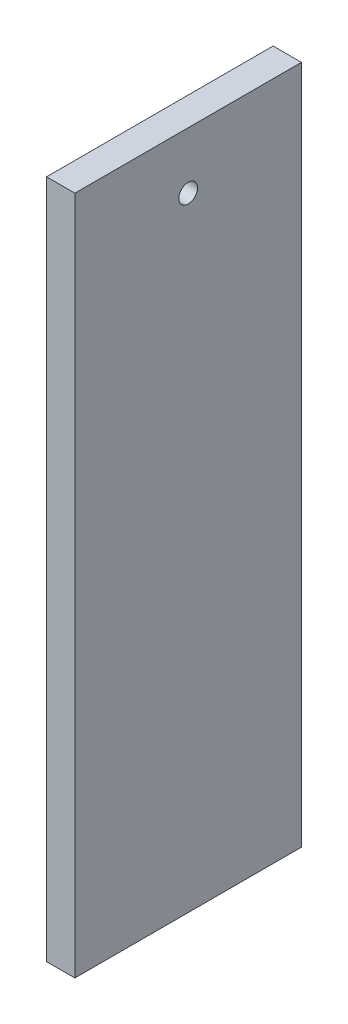
ISO-10303-21;
HEADER;
FILE_DESCRIPTION(('STEP AP214'),'2;1');
FILE_NAME('part.step','',(''),(''),'','','');
FILE_SCHEMA(('AUTOMOTIVE_DESIGN { 1 0 10303 214 1 1 1 1 }'));
ENDSEC;
DATA;
#1=APPLICATION_CONTEXT('core data for automotive mechanical design processes');
#2=APPLICATION_PROTOCOL_DEFINITION('international standard','automotive_design',2000,#1);
#3=PRODUCT_CONTEXT('',#1,'mechanical');
#4=PRODUCT('Part','Part','',(#3));
#5=PRODUCT_RELATED_PRODUCT_CATEGORY('part','',(#4));
#6=PRODUCT_DEFINITION_FORMATION('','',#4);
#7=PRODUCT_DEFINITION_CONTEXT('part definition',#1,'design');
#8=PRODUCT_DEFINITION('design','',#6,#7);
#9=PRODUCT_DEFINITION_SHAPE('','',#8);
#10=(LENGTH_UNIT() NAMED_UNIT(*) SI_UNIT(.MILLI.,.METRE.));
#11=(NAMED_UNIT(*) PLANE_ANGLE_UNIT() SI_UNIT($,.RADIAN.));
#12=(NAMED_UNIT(*) SI_UNIT($,.STERADIAN.) SOLID_ANGLE_UNIT());
#13=UNCERTAINTY_MEASURE_WITH_UNIT(LENGTH_MEASURE(1.E-05),#10,'distance_accuracy_value','');
#14=(GEOMETRIC_REPRESENTATION_CONTEXT(3) GLOBAL_UNCERTAINTY_ASSIGNED_CONTEXT((#13)) GLOBAL_UNIT_ASSIGNED_CONTEXT((#10,
#11,#12)) REPRESENTATION_CONTEXT('',''));
#15=CARTESIAN_POINT('',(0.,0.,0.));
#16=DIRECTION('',(0.,0.,1.));
#17=DIRECTION('',(1.,0.,0.));
#18=AXIS2_PLACEMENT_3D('',#15,#16,#17);
#19=CARTESIAN_POINT('',(5.,0.,0.));
#20=DIRECTION('',(0.,-1.,0.));
#21=DIRECTION('',(0.,0.,-1.));
#22=AXIS2_PLACEMENT_3D('',#19,#20,#21);
#23=PLANE('',#22);
#24=DIRECTION('',(0.,0.,1.));
#25=VECTOR('',#24,1.);
#26=CARTESIAN_POINT('',(0.,0.,0.));
#27=LINE('',#26,#25);
#28=CARTESIAN_POINT('',(0.,0.,0.));
#29=VERTEX_POINT('',#28);
#30=CARTESIAN_POINT('',(0.,0.,40.));
#31=VERTEX_POINT('',#30);
#32=EDGE_CURVE('E100',#29,#31,#27,.T.);
#33=ORIENTED_EDGE('',*,*,#32,.F.);
#34=DIRECTION('',(-1.,0.,0.));
#35=VECTOR('',#34,1.);
#36=CARTESIAN_POINT('',(5.,0.,0.));
#37=LINE('',#36,#35);
#38=CARTESIAN_POINT('',(5.,0.,0.));
#39=VERTEX_POINT('',#38);
#40=EDGE_CURVE('E11',#39,#29,#37,.T.);
#41=ORIENTED_EDGE('',*,*,#40,.F.);
#42=DIRECTION('',(0.,0.,1.));
#43=VECTOR('',#42,1.);
#44=CARTESIAN_POINT('',(5.,0.,0.));
#45=LINE('',#44,#43);
#46=CARTESIAN_POINT('',(5.,0.,40.));
#47=VERTEX_POINT('',#46);
#48=EDGE_CURVE('E94',#39,#47,#45,.T.);
#49=ORIENTED_EDGE('',*,*,#48,.T.);
#50=DIRECTION('',(-1.,0.,0.));
#51=VECTOR('',#50,1.);
#52=CARTESIAN_POINT('',(5.,0.,40.));
#53=LINE('',#52,#51);
#54=EDGE_CURVE('E37',#47,#31,#53,.T.);
#55=ORIENTED_EDGE('',*,*,#54,.T.);
#56=EDGE_LOOP('',(#33,#41,#49,#55));
#57=FACE_BOUND('',#56,.T.);
#58=ADVANCED_FACE('F34',(#57),#23,.T.);
#59=CARTESIAN_POINT('',(5.,0.,0.));
#60=DIRECTION('',(0.,0.,1.));
#61=DIRECTION('',(1.,0.,0.));
#62=AXIS2_PLACEMENT_3D('',#59,#60,#61);
#63=PLANE('',#62);
#64=DIRECTION('',(0.,1.,0.));
#65=VECTOR('',#64,1.);
#66=CARTESIAN_POINT('',(0.,0.,0.));
#67=LINE('',#66,#65);
#68=CARTESIAN_POINT('',(0.,120.,0.));
#69=VERTEX_POINT('',#68);
#70=EDGE_CURVE('E67',#29,#69,#67,.T.);
#71=ORIENTED_EDGE('',*,*,#70,.T.);
#72=DIRECTION('',(-1.,0.,0.));
#73=VECTOR('',#72,1.);
#74=CARTESIAN_POINT('',(5.,120.,0.));
#75=LINE('',#74,#73);
#76=CARTESIAN_POINT('',(5.,120.,0.));
#77=VERTEX_POINT('',#76);
#78=EDGE_CURVE('E43',#77,#69,#75,.T.);
#79=ORIENTED_EDGE('',*,*,#78,.F.);
#80=DIRECTION('',(0.,1.,0.));
#81=VECTOR('',#80,1.);
#82=CARTESIAN_POINT('',(5.,0.,0.));
#83=LINE('',#82,#81);
#84=EDGE_CURVE('E84',#39,#77,#83,.T.);
#85=ORIENTED_EDGE('',*,*,#84,.F.);
#86=ORIENTED_EDGE('',*,*,#40,.T.);
#87=EDGE_LOOP('',(#71,#79,#85,#86));
#88=FACE_BOUND('',#87,.T.);
#89=ADVANCED_FACE('F111',(#88),#63,.F.);
#90=CARTESIAN_POINT('',(5.,120.,0.));
#91=DIRECTION('',(0.,-1.,0.));
#92=DIRECTION('',(0.,0.,-1.));
#93=AXIS2_PLACEMENT_3D('',#90,#91,#92);
#94=PLANE('',#93);
#95=DIRECTION('',(0.,0.,1.));
#96=VECTOR('',#95,1.);
#97=CARTESIAN_POINT('',(0.,120.,0.));
#98=LINE('',#97,#96);
#99=CARTESIAN_POINT('',(0.,120.,40.));
#100=VERTEX_POINT('',#99);
#101=EDGE_CURVE('E91',#69,#100,#98,.T.);
#102=ORIENTED_EDGE('',*,*,#101,.T.);
#103=DIRECTION('',(-1.,0.,0.));
#104=VECTOR('',#103,1.);
#105=CARTESIAN_POINT('',(5.,120.,40.));
#106=LINE('',#105,#104);
#107=CARTESIAN_POINT('',(5.,120.,40.));
#108=VERTEX_POINT('',#107);
#109=EDGE_CURVE('E88',#108,#100,#106,.T.);
#110=ORIENTED_EDGE('',*,*,#109,.F.);
#111=DIRECTION('',(0.,0.,1.));
#112=VECTOR('',#111,1.);
#113=CARTESIAN_POINT('',(5.,120.,0.));
#114=LINE('',#113,#112);
#115=EDGE_CURVE('E79',#77,#108,#114,.T.);
#116=ORIENTED_EDGE('',*,*,#115,.F.);
#117=ORIENTED_EDGE('',*,*,#78,.T.);
#118=EDGE_LOOP('',(#102,#110,#116,#117));
#119=FACE_BOUND('',#118,.T.);
#120=ADVANCED_FACE('F89',(#119),#94,.F.);
#121=CARTESIAN_POINT('',(5.,0.,40.));
#122=DIRECTION('',(0.,0.,1.));
#123=DIRECTION('',(1.,0.,0.));
#124=AXIS2_PLACEMENT_3D('',#121,#122,#123);
#125=PLANE('',#124);
#126=DIRECTION('',(0.,1.,0.));
#127=VECTOR('',#126,1.);
#128=CARTESIAN_POINT('',(0.,0.,40.));
#129=LINE('',#128,#127);
#130=EDGE_CURVE('E103',#31,#100,#129,.T.);
#131=ORIENTED_EDGE('',*,*,#130,.F.);
#132=ORIENTED_EDGE('',*,*,#54,.F.);
#133=DIRECTION('',(0.,1.,0.));
#134=VECTOR('',#133,1.);
#135=CARTESIAN_POINT('',(5.,0.,40.));
#136=LINE('',#135,#134);
#137=EDGE_CURVE('E83',#47,#108,#136,.T.);
#138=ORIENTED_EDGE('',*,*,#137,.T.);
#139=ORIENTED_EDGE('',*,*,#109,.T.);
#140=EDGE_LOOP('',(#131,#132,#138,#139));
#141=FACE_BOUND('',#140,.T.);
#142=ADVANCED_FACE('F93',(#141),#125,.T.);
#143=CARTESIAN_POINT('',(5.,0.,0.));
#144=DIRECTION('',(-1.,0.,0.));
#145=DIRECTION('',(0.,0.,1.));
#146=AXIS2_PLACEMENT_3D('',#143,#144,#145);
#147=PLANE('',#146);
#148=CARTESIAN_POINT('',(5.,110.,20.));
#149=DIRECTION('',(1.,0.,0.));
#150=DIRECTION('',(0.,0.,-1.));
#151=AXIS2_PLACEMENT_3D('',#148,#149,#150);
#152=CIRCLE('',#151,1.65);
#153=CARTESIAN_POINT('',(5.,110.,18.35));
#154=VERTEX_POINT('',#153);
#155=EDGE_CURVE('E143',#154,#154,#152,.T.);
#156=ORIENTED_EDGE('',*,*,#155,.F.);
#157=EDGE_LOOP('',(#156));
#158=FACE_BOUND('',#157,.T.);
#159=ORIENTED_EDGE('',*,*,#48,.F.);
#160=ORIENTED_EDGE('',*,*,#84,.T.);
#161=ORIENTED_EDGE('',*,*,#115,.T.);
#162=ORIENTED_EDGE('',*,*,#137,.F.);
#163=EDGE_LOOP('',(#159,#160,#161,#162));
#164=FACE_BOUND('',#163,.T.);
#165=ADVANCED_FACE('F82',(#158,#164),#147,.F.);
#166=CARTESIAN_POINT('',(0.,0.,0.));
#167=DIRECTION('',(-1.,0.,0.));
#168=DIRECTION('',(0.,0.,1.));
#169=AXIS2_PLACEMENT_3D('',#166,#167,#168);
#170=PLANE('',#169);
#171=CARTESIAN_POINT('',(0.,110.,20.));
#172=DIRECTION('',(1.,0.,0.));
#173=DIRECTION('',(0.,0.,-1.));
#174=AXIS2_PLACEMENT_3D('',#171,#172,#173);
#175=CIRCLE('',#174,1.65);
#176=CARTESIAN_POINT('',(0.,110.,18.35));
#177=VERTEX_POINT('',#176);
#178=EDGE_CURVE('E104',#177,#177,#175,.T.);
#179=ORIENTED_EDGE('',*,*,#178,.T.);
#180=EDGE_LOOP('',(#179));
#181=FACE_BOUND('',#180,.T.);
#182=ORIENTED_EDGE('',*,*,#32,.T.);
#183=ORIENTED_EDGE('',*,*,#130,.T.);
#184=ORIENTED_EDGE('',*,*,#101,.F.);
#185=ORIENTED_EDGE('',*,*,#70,.F.);
#186=EDGE_LOOP('',(#182,#183,#184,#185));
#187=FACE_BOUND('',#186,.T.);
#188=ADVANCED_FACE('F109',(#181,#187),#170,.T.);
#189=CARTESIAN_POINT('',(0.,110.,20.));
#190=DIRECTION('',(1.,0.,0.));
#191=DIRECTION('',(0.,0.,-1.));
#192=AXIS2_PLACEMENT_3D('',#189,#190,#191);
#193=CYLINDRICAL_SURFACE('',#192,1.65);
#194=ORIENTED_EDGE('',*,*,#178,.F.);
#195=EDGE_LOOP('',(#194));
#196=FACE_BOUND('',#195,.T.);
#197=ORIENTED_EDGE('',*,*,#155,.T.);
#198=EDGE_LOOP('',(#197));
#199=FACE_BOUND('',#198,.T.);
#200=ADVANCED_FACE('F130',(#196,#199),#193,.F.);
#201=CLOSED_SHELL('',(#58,#89,#120,#142,#165,#188,#200));
#202=MANIFOLD_SOLID_BREP('B2',#201);
#203=ADVANCED_BREP_SHAPE_REPRESENTATION('',(#18,#202),#14);
#204=SHAPE_DEFINITION_REPRESENTATION(#9,#203);
ENDSEC;
END-ISO-10303-21;
